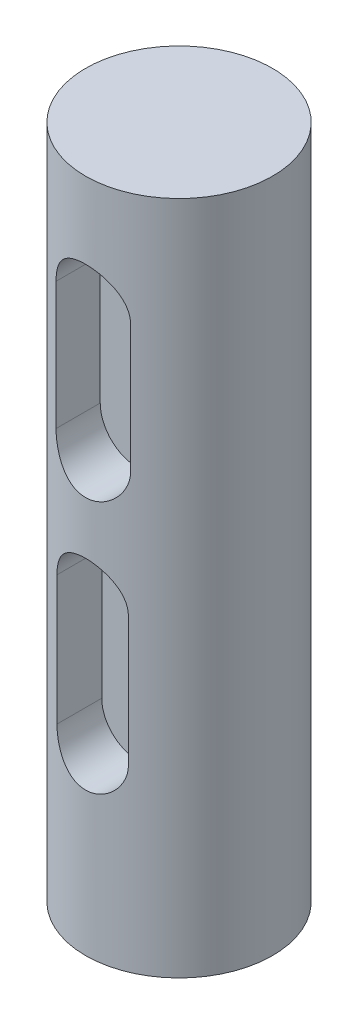
ISO-10303-21;
HEADER;
FILE_DESCRIPTION(('STEP AP214'),'2;1');
FILE_NAME('part.step','',(''),(''),'','','');
FILE_SCHEMA(('AUTOMOTIVE_DESIGN { 1 0 10303 214 1 1 1 1 }'));
ENDSEC;
DATA;
#1=APPLICATION_CONTEXT('core data for automotive mechanical design processes');
#2=APPLICATION_PROTOCOL_DEFINITION('international standard','automotive_design',2000,#1);
#3=PRODUCT_CONTEXT('',#1,'mechanical');
#4=PRODUCT('Part','Part','',(#3));
#5=PRODUCT_RELATED_PRODUCT_CATEGORY('part','',(#4));
#6=PRODUCT_DEFINITION_FORMATION('','',#4);
#7=PRODUCT_DEFINITION_CONTEXT('part definition',#1,'design');
#8=PRODUCT_DEFINITION('design','',#6,#7);
#9=PRODUCT_DEFINITION_SHAPE('','',#8);
#10=(LENGTH_UNIT() NAMED_UNIT(*) SI_UNIT(.MILLI.,.METRE.));
#11=(NAMED_UNIT(*) PLANE_ANGLE_UNIT() SI_UNIT($,.RADIAN.));
#12=(NAMED_UNIT(*) SI_UNIT($,.STERADIAN.) SOLID_ANGLE_UNIT());
#13=UNCERTAINTY_MEASURE_WITH_UNIT(LENGTH_MEASURE(1.E-05),#10,'distance_accuracy_value','');
#14=(GEOMETRIC_REPRESENTATION_CONTEXT(3) GLOBAL_UNCERTAINTY_ASSIGNED_CONTEXT((#13)) GLOBAL_UNIT_ASSIGNED_CONTEXT((#10,
#11,#12)) REPRESENTATION_CONTEXT('',''));
#15=CARTESIAN_POINT('',(0.,0.,0.));
#16=DIRECTION('',(0.,0.,1.));
#17=DIRECTION('',(1.,0.,0.));
#18=AXIS2_PLACEMENT_3D('',#15,#16,#17);
#19=CARTESIAN_POINT('',(0.,75.,0.));
#20=DIRECTION('',(0.,-1.,0.));
#21=DIRECTION('',(0.,0.,-1.));
#22=AXIS2_PLACEMENT_3D('',#19,#20,#21);
#23=CYLINDRICAL_SURFACE('',#22,9.);
#24=DIRECTION('',(0.,-1.,0.));
#25=VECTOR('',#24,1.);
#26=CARTESIAN_POINT('',(-3.59075279249924,75.,8.25266589552484));
#27=LINE('',#26,#25);
#28=CARTESIAN_POINT('',(-3.59075279249924,51.7898163154883,8.25266589552484));
#29=VERTEX_POINT('',#28);
#30=CARTESIAN_POINT('',(-3.59075279249924,64.069272058532,8.25266589552484));
#31=VERTEX_POINT('',#30);
#32=EDGE_CURVE('E11',#29,#31,#27,.F.);
#33=ORIENTED_EDGE('',*,*,#32,.T.);
#34=CARTESIAN_POINT('',(-3.59075279249924,64.069272058532,8.25266589552484));
#35=CARTESIAN_POINT('',(-3.59076709651174,64.1658968866737,8.25264612613384));
#36=CARTESIAN_POINT('',(-3.58685301131658,64.2625109089135,8.25436238712671));
#37=CARTESIAN_POINT('',(-3.57127985461796,64.4549601143541,8.26111925578927));
#38=CARTESIAN_POINT('',(-3.55962371784079,64.5507955787492,8.266158603794));
#39=CARTESIAN_POINT('',(-3.52873863815754,64.7406326124207,8.27938820607556));
#40=CARTESIAN_POINT('',(-3.5095395051871,64.8346398902062,8.28756605408234));
#41=CARTESIAN_POINT('',(-3.46378376848268,65.020524449781,8.30679330478129));
#42=CARTESIAN_POINT('',(-3.4372267188772,65.1124016021244,8.31784288149059));
#43=CARTESIAN_POINT('',(-3.34693519354362,65.3837137113802,8.35477670172495));
#44=CARTESIAN_POINT('',(-3.27251821463925,65.5592053813268,8.38447437109656));
#45=CARTESIAN_POINT('',(-3.09760834717961,65.8952866001117,8.45065222473362));
#46=CARTESIAN_POINT('',(-2.99709081465851,66.0558618693801,8.48713880976911));
#47=CARTESIAN_POINT('',(-2.76678797282219,66.3665839232752,8.5650673580961));
#48=CARTESIAN_POINT('',(-2.63577050713792,66.5157798647041,8.60666720536653));
#49=CARTESIAN_POINT('',(-2.35080086119998,66.7907550095467,8.68882660197574));
#50=CARTESIAN_POINT('',(-2.19684399599132,66.9165294177056,8.7293859368207));
#51=CARTESIAN_POINT('',(-1.86291833405368,67.1458994838985,8.80681575203263));
#52=CARTESIAN_POINT('',(-1.68216537916092,67.2484300106859,8.84347877797822));
#53=CARTESIAN_POINT('',(-1.30425480268085,67.4212179182776,8.90705063889267));
#54=CARTESIAN_POINT('',(-1.10710403695434,67.4914887074321,8.93396352540065));
#55=CARTESIAN_POINT('',(-0.712072167601763,67.5943370425934,8.97387538097098));
#56=CARTESIAN_POINT('',(-0.514684215767548,67.628568023177,8.9874824304237));
#57=CARTESIAN_POINT('',(-0.116524494222606,67.6636882809914,9.00144682073262));
#58=CARTESIAN_POINT('',(0.0842460585362407,67.6645893034143,9.0018088290275));
#59=CARTESIAN_POINT('',(0.471521063273848,67.6339315175917,8.98961246121658));
#60=CARTESIAN_POINT('',(0.658195722534287,67.6041839944227,8.97777504261354));
#61=CARTESIAN_POINT('',(1.0236452501598,67.5161531166525,8.94348079918929));
#62=CARTESIAN_POINT('',(1.20241967067364,67.4578681465681,8.92102337318));
#63=CARTESIAN_POINT('',(1.55021403821633,67.3137023219387,8.86725972291739));
#64=CARTESIAN_POINT('',(1.71904653631176,67.2274190928186,8.83582532925205));
#65=CARTESIAN_POINT('',(2.04027578588213,67.0300724957277,8.76722826130333));
#66=CARTESIAN_POINT('',(2.1926667588418,66.9190004573309,8.73006358413793));
#67=CARTESIAN_POINT('',(2.48723266522941,66.6668105543173,8.65092131531831));
#68=CARTESIAN_POINT('',(2.62809111247902,66.5242045403318,8.60878791330133));
#69=CARTESIAN_POINT('',(2.88449695700154,66.2170990971296,8.52630393976015));
#70=CARTESIAN_POINT('',(3.00003289670429,66.0525898113221,8.48595418183853));
#71=CARTESIAN_POINT('',(3.15331874440256,65.7899681181672,8.42968932984504));
#72=CARTESIAN_POINT('',(3.20161304438927,65.6983632139531,8.41141679363003));
#73=CARTESIAN_POINT('',(3.29024113557402,65.5109872770805,8.37714566146151));
#74=CARTESIAN_POINT('',(3.33057835674223,65.4152180613084,8.36114608656357));
#75=CARTESIAN_POINT('',(3.40286230014206,65.2202840847592,8.33198953593521));
#76=CARTESIAN_POINT('',(3.43481941395235,65.1211237033572,8.31882904328712));
#77=CARTESIAN_POINT('',(3.49005588446221,64.9200829086853,8.29580613507968));
#78=CARTESIAN_POINT('',(3.51333913286549,64.818203737296,8.28594224064029));
#79=CARTESIAN_POINT('',(3.55159656261248,64.6090287399184,8.26962135484079));
#80=CARTESIAN_POINT('',(3.56626259279074,64.501666327232,8.26329107630287));
#81=CARTESIAN_POINT('',(3.58584966301004,64.2859638341549,8.25479871639156));
#82=CARTESIAN_POINT('',(3.59077684984484,64.1776244138256,8.25263400589022));
#83=CARTESIAN_POINT('',(3.59075279249924,64.069272058532,8.25266589552485));
#84=B_SPLINE_CURVE_WITH_KNOTS('',3,(#34,#35,#36,#37,#38,#39,#40,#41,#42,#43,#44,#45,#46,#47,#48,
#49,#50,#51,#52,#53,#54,#55,#56,#57,#58,#59,#60,#61,#62,#63,#64,#65,#66,#67,#68,#69,#70,#71,#72,
#73,#74,#75,#76,#77,#78,#79,#80,#81,#82,#83),.UNSPECIFIED.,.F.,.F.,(4,2,2,2,2,2,2,2,2,2,2,2,2,2,
2,2,2,2,2,2,2,2,2,2,4),(0.,0.289761992126611,0.579414208803354,0.867933051447296,
1.15646938144347,1.73240982352938,2.30889605467612,2.91481176706974,3.52085139677538,
4.1506941892618,4.78027495805066,5.37951245530823,5.97853878438653,6.54408701922678,
7.10966727302489,7.68376516098306,8.25806416776978,8.86985669930655,9.48192547722016,
9.79705360351955,10.1120455927474,10.4266451155904,10.7411033165615,11.0662126321862,
11.3911166853599),.UNSPECIFIED.);
#85=CARTESIAN_POINT('',(3.59075279249924,64.069272058532,8.25266589552484));
#86=VERTEX_POINT('',#85);
#87=EDGE_CURVE('E241',#31,#86,#84,.T.);
#88=ORIENTED_EDGE('',*,*,#87,.T.);
#89=DIRECTION('',(0.,-1.,0.));
#90=VECTOR('',#89,1.);
#91=CARTESIAN_POINT('',(3.59075279249924,75.,8.25266589552484));
#92=LINE('',#91,#90);
#93=CARTESIAN_POINT('',(3.59075279249924,51.7898163154883,8.25266589552484));
#94=VERTEX_POINT('',#93);
#95=EDGE_CURVE('E52',#86,#94,#92,.T.);
#96=ORIENTED_EDGE('',*,*,#95,.T.);
#97=CARTESIAN_POINT('',(3.59075279249924,51.7898163154883,8.25266589552485));
#98=CARTESIAN_POINT('',(3.59076709651174,51.6931914873466,8.25264612613384));
#99=CARTESIAN_POINT('',(3.58685301131658,51.5965774651067,8.25436238712671));
#100=CARTESIAN_POINT('',(3.57127985461796,51.4041282596661,8.26111925578927));
#101=CARTESIAN_POINT('',(3.55962371784079,51.308292795271,8.266158603794));
#102=CARTESIAN_POINT('',(3.52873863815754,51.1184557615995,8.27938820607557));
#103=CARTESIAN_POINT('',(3.50953950518709,51.0244484838141,8.28756605408234));
#104=CARTESIAN_POINT('',(3.46378376848268,50.8385639242392,8.30679330478129));
#105=CARTESIAN_POINT('',(3.4372267188772,50.7466867718959,8.31784288149058));
#106=CARTESIAN_POINT('',(3.34693519354362,50.4753746626401,8.35477670172495));
#107=CARTESIAN_POINT('',(3.27251821463925,50.2998829926934,8.38447437109655));
#108=CARTESIAN_POINT('',(3.0976083471796,49.9638017739085,8.45065222473362));
#109=CARTESIAN_POINT('',(2.9970908146585,49.8032265046402,8.48713880976911));
#110=CARTESIAN_POINT('',(2.76678797282218,49.4925044507451,8.5650673580961));
#111=CARTESIAN_POINT('',(2.63577050713791,49.3433085093162,8.60666720536654));
#112=CARTESIAN_POINT('',(2.35080086119998,49.0683333644736,8.68882660197574));
#113=CARTESIAN_POINT('',(2.19684399599131,48.9425589563147,8.72938593682069));
#114=CARTESIAN_POINT('',(1.86291833405368,48.7131888901217,8.80681575203263));
#115=CARTESIAN_POINT('',(1.68216537916092,48.6106583633344,8.84347877797821));
#116=CARTESIAN_POINT('',(1.30425480268085,48.4378704557426,8.90705063889267));
#117=CARTESIAN_POINT('',(1.10710403695434,48.3675996665882,8.93396352540065));
#118=CARTESIAN_POINT('',(0.71207216760177,48.2647513314268,8.97387538097098));
#119=CARTESIAN_POINT('',(0.514684215767555,48.2305203508433,8.9874824304237));
#120=CARTESIAN_POINT('',(0.11652449422261,48.1954000930289,9.00144682073262));
#121=CARTESIAN_POINT('',(-0.0842460585362386,48.194499070606,9.0018088290275));
#122=CARTESIAN_POINT('',(-0.471521063273848,48.2251568564285,8.98961246121658));
#123=CARTESIAN_POINT('',(-0.658195722534286,48.2549043795975,8.97777504261354));
#124=CARTESIAN_POINT('',(-1.0236452501598,48.3429352573677,8.94348079918929));
#125=CARTESIAN_POINT('',(-1.20241967067364,48.4012202274522,8.92102337318));
#126=CARTESIAN_POINT('',(-1.55021403821633,48.5453860520816,8.86725972291739));
#127=CARTESIAN_POINT('',(-1.71904653631176,48.6316692812017,8.83582532925205));
#128=CARTESIAN_POINT('',(-2.04027578588213,48.8290158782925,8.76722826130333));
#129=CARTESIAN_POINT('',(-2.1926667588418,48.9400879166894,8.73006358413793));
#130=CARTESIAN_POINT('',(-2.48723266522941,49.1922778197029,8.65092131531831));
#131=CARTESIAN_POINT('',(-2.62809111247902,49.3348838336885,8.60878791330133));
#132=CARTESIAN_POINT('',(-2.88449695700154,49.6419892768906,8.52630393976015));
#133=CARTESIAN_POINT('',(-3.00003289670429,49.8064985626981,8.48595418183852));
#134=CARTESIAN_POINT('',(-3.15331874440256,50.069120255853,8.42968932984504));
#135=CARTESIAN_POINT('',(-3.20161304438926,50.1607251600672,8.41141679363003));
#136=CARTESIAN_POINT('',(-3.29024113557401,50.3481010969398,8.37714566146152));
#137=CARTESIAN_POINT('',(-3.33057835674223,50.4438703127119,8.36114608656358));
#138=CARTESIAN_POINT('',(-3.40286230014206,50.638804289261,8.33198953593521));
#139=CARTESIAN_POINT('',(-3.43481941395235,50.7379646706631,8.31882904328712));
#140=CARTESIAN_POINT('',(-3.49005588446221,50.939005465335,8.29580613507968));
#141=CARTESIAN_POINT('',(-3.51333913286549,51.0408846367242,8.28594224064029));
#142=CARTESIAN_POINT('',(-3.55159656261248,51.2500596341019,8.2696213548408));
#143=CARTESIAN_POINT('',(-3.56626259279074,51.3574220467883,8.26329107630287));
#144=CARTESIAN_POINT('',(-3.58584966301004,51.5731245398654,8.25479871639156));
#145=CARTESIAN_POINT('',(-3.59077684984484,51.6814639601946,8.25263400589023));
#146=CARTESIAN_POINT('',(-3.59075279249924,51.7898163154883,8.25266589552485));
#147=B_SPLINE_CURVE_WITH_KNOTS('',3,(#97,#98,#99,#100,#101,#102,#103,#104,#105,#106,#107,#108,
#109,#110,#111,#112,#113,#114,#115,#116,#117,#118,#119,#120,#121,#122,#123,#124,#125,#126,#127,
#128,#129,#130,#131,#132,#133,#134,#135,#136,#137,#138,#139,#140,#141,#142,#143,#144,#145,#146),
.UNSPECIFIED.,.F.,.F.,(4,2,2,2,2,2,2,2,2,2,2,2,2,2,2,2,2,2,2,2,2,2,2,2,4),(0.,0.289761992126632,
0.579414208803375,0.867933051447303,1.15646938144347,1.7324098235294,2.30889605467614,
2.91481176706975,3.52085139677538,4.15069418926179,4.78027495805065,5.37951245530822,
5.97853878438652,6.54408701922678,7.10966727302489,7.68376516098306,8.25806416776977,
8.86985669930653,9.48192547722016,9.79705360351954,10.1120455927474,10.4266451155904,
10.7411033165615,11.0662126321862,11.3911166853599),.UNSPECIFIED.);
#148=EDGE_CURVE('E59',#94,#29,#147,.T.);
#149=ORIENTED_EDGE('',*,*,#148,.T.);
#150=EDGE_LOOP('',(#33,#88,#96,#149));
#151=FACE_BOUND('',#150,.T.);
#152=DIRECTION('',(0.,-1.,0.));
#153=VECTOR('',#152,1.);
#154=CARTESIAN_POINT('',(-3.44161609504719,75.,8.31596528698335));
#155=LINE('',#154,#153);
#156=CARTESIAN_POINT('',(-3.44161609504719,27.2483775892211,8.31596528698335));
#157=VERTEX_POINT('',#156);
#158=CARTESIAN_POINT('',(-3.44161609504719,39.6967762308812,8.31596528698335));
#159=VERTEX_POINT('',#158);
#160=EDGE_CURVE('E235',#157,#159,#155,.F.);
#161=ORIENTED_EDGE('',*,*,#160,.T.);
#162=CARTESIAN_POINT('',(-3.44161609504719,39.6967762308812,8.31596528698335));
#163=CARTESIAN_POINT('',(-3.44162944610178,39.7897359410919,8.3159473977352));
#164=CARTESIAN_POINT('',(-3.43785010797841,39.882685848242,8.31752357689273));
#165=CARTESIAN_POINT('',(-3.42281030430182,40.0678442682913,8.32373054436181));
#166=CARTESIAN_POINT('',(-3.41155244700991,40.1600530283343,8.32836026769366));
#167=CARTESIAN_POINT('',(-3.38171434418882,40.3427387118354,8.34051871117113));
#168=CARTESIAN_POINT('',(-3.36316100870783,40.4332207328121,8.34803677509033));
#169=CARTESIAN_POINT('',(-3.31893507752917,40.6121420323086,8.36571779720752));
#170=CARTESIAN_POINT('',(-3.29326209909297,40.7005812007316,8.37588089759588));
#171=CARTESIAN_POINT('',(-3.2059495141957,40.9617724623423,8.40986490833764));
#172=CARTESIAN_POINT('',(-3.13396045291825,41.1307350742718,8.43720473801134));
#173=CARTESIAN_POINT('',(-2.96470161139858,41.4542444285838,8.49815238691096));
#174=CARTESIAN_POINT('',(-2.86741016906527,41.608778663602,8.5317655699371));
#175=CARTESIAN_POINT('',(-2.64494010081819,41.9070243671511,8.60340354604182));
#176=CARTESIAN_POINT('',(-2.51866988064436,42.0498914477862,8.64156115225438));
#177=CARTESIAN_POINT('',(-2.24414680901578,42.3130133432318,8.71688282229207));
#178=CARTESIAN_POINT('',(-2.09588964058467,42.4332637068747,8.75404668930863));
#179=CARTESIAN_POINT('',(-1.77509335025524,42.6518984073682,8.82479060427513));
#180=CARTESIAN_POINT('',(-1.60187753397646,42.7493515760627,8.85819589924715));
#181=CARTESIAN_POINT('',(-1.24001013085664,42.9133762630388,8.91604598525601));
#182=CARTESIAN_POINT('',(-1.05136453068404,42.9799596923657,8.9404942315923));
#183=CARTESIAN_POINT('',(-0.67293101539553,43.0773582237,8.97672878470203));
#184=CARTESIAN_POINT('',(-0.483570626826958,43.109638358715,8.98903195928352));
#185=CARTESIAN_POINT('',(-0.101744140097608,43.1422150606168,9.00144904188801));
#186=CARTESIAN_POINT('',(0.0907209410987434,43.1425218960506,9.00156686335967));
#187=CARTESIAN_POINT('',(0.462762364696906,43.1119806317634,8.98992410345663));
#188=CARTESIAN_POINT('',(0.642492599240474,43.0827335541362,8.97877393955046));
#189=CARTESIAN_POINT('',(0.994267625852061,42.9966173902006,8.9466553710748));
#190=CARTESIAN_POINT('',(1.16631198087508,42.9397467353001,8.92568640895182));
#191=CARTESIAN_POINT('',(1.50085099852246,42.7992871432034,8.87561266087173));
#192=CARTESIAN_POINT('',(1.66316752848686,42.715316750896,8.84639251361648));
#193=CARTESIAN_POINT('',(1.97181457069996,42.5233867388531,8.7827567900254));
#194=CARTESIAN_POINT('',(2.11813972883839,42.4154191210304,8.74833948274591));
#195=CARTESIAN_POINT('',(2.40004858635442,42.1709146810063,8.67538138807613));
#196=CARTESIAN_POINT('',(2.5344458844829,42.033044089369,8.63671710750559));
#197=CARTESIAN_POINT('',(2.77868295914476,41.7365279461087,8.56126713249105));
#198=CARTESIAN_POINT('',(2.88851267194718,41.5778739229167,8.52448221264151));
#199=CARTESIAN_POINT('',(3.08295695277028,41.2391932946528,8.4561408548142));
#200=CARTESIAN_POINT('',(3.16689122249884,41.0587398061984,8.42473381408577));
#201=CARTESIAN_POINT('',(3.26869220019801,40.7785711340614,8.38552016481041));
#202=CARTESIAN_POINT('',(3.29860517404841,40.6836221876886,8.37376682493255));
#203=CARTESIAN_POINT('',(3.35015199371231,40.4911976660463,8.35327798654851));
#204=CARTESIAN_POINT('',(3.37178956858183,40.393723249996,8.34454112892967));
#205=CARTESIAN_POINT('',(3.40657856234909,40.1967464682883,8.3304019174156));
#206=CARTESIAN_POINT('',(3.41970552641287,40.097239098726,8.32500917459007));
#207=CARTESIAN_POINT('',(3.43722960511469,39.897417295057,8.31778027690792));
#208=CARTESIAN_POINT('',(3.44163409893674,39.7971036152962,8.31594111576378));
#209=CARTESIAN_POINT('',(3.44161609504719,39.6967762308812,8.31596528698335));
#210=B_SPLINE_CURVE_WITH_KNOTS('',3,(#162,#163,#164,#165,#166,#167,#168,#169,#170,#171,#172,
#173,#174,#175,#176,#177,#178,#179,#180,#181,#182,#183,#184,#185,#186,#187,#188,#189,#190,#191,
#192,#193,#194,#195,#196,#197,#198,#199,#200,#201,#202,#203,#204,#205,#206,#207,#208,#209),
.UNSPECIFIED.,.F.,.F.,(4,2,2,2,2,2,2,2,2,2,2,2,2,2,2,2,2,2,2,2,2,2,2,4),(0.,0.278772585011864,
0.557447994332301,0.835104983333213,1.11277690154271,1.66710700323056,2.22191325404647,
2.80267160848012,3.3835441419019,3.98510217255019,4.58642789931251,5.16088992562772,
5.73516745711433,6.27991846830345,6.82470041654394,7.37751209785385,7.93050830398818,
8.51697936818884,9.10369023302002,9.70471032871195,10.0050877214768,10.3053295984061,
10.6064304265881,10.9072764153554),.UNSPECIFIED.);
#211=CARTESIAN_POINT('',(3.44161609504719,39.6967762308812,8.31596528698335));
#212=VERTEX_POINT('',#211);
#213=EDGE_CURVE('E184',#159,#212,#210,.T.);
#214=ORIENTED_EDGE('',*,*,#213,.T.);
#215=DIRECTION('',(0.,-1.,0.));
#216=VECTOR('',#215,1.);
#217=CARTESIAN_POINT('',(3.44161609504719,75.,8.31596528698335));
#218=LINE('',#217,#216);
#219=CARTESIAN_POINT('',(3.44161609504719,27.2483775892211,8.31596528698335));
#220=VERTEX_POINT('',#219);
#221=EDGE_CURVE('E242',#212,#220,#218,.T.);
#222=ORIENTED_EDGE('',*,*,#221,.T.);
#223=CARTESIAN_POINT('',(3.44161609504719,27.2483775892211,8.31596528698335));
#224=CARTESIAN_POINT('',(3.44162944610178,27.1554178790104,8.3159473977352));
#225=CARTESIAN_POINT('',(3.43785010797841,27.0624679718603,8.31752357689273));
#226=CARTESIAN_POINT('',(3.42281030430182,26.8773095518111,8.32373054436181));
#227=CARTESIAN_POINT('',(3.41155244700992,26.7851007917681,8.32836026769366));
#228=CARTESIAN_POINT('',(3.38171434418882,26.6024151082669,8.34051871117113));
#229=CARTESIAN_POINT('',(3.36316100870783,26.5119330872902,8.34803677509033));
#230=CARTESIAN_POINT('',(3.31893507752917,26.3330117877937,8.36571779720752));
#231=CARTESIAN_POINT('',(3.29326209909296,26.2445726193707,8.37588089759588));
#232=CARTESIAN_POINT('',(3.2059495141957,25.9833813577601,8.40986490833764));
#233=CARTESIAN_POINT('',(3.13396045291825,25.8144187458305,8.43720473801134));
#234=CARTESIAN_POINT('',(2.96470161139858,25.4909093915185,8.49815238691096));
#235=CARTESIAN_POINT('',(2.86741016906526,25.3363751565003,8.5317655699371));
#236=CARTESIAN_POINT('',(2.64494010081819,25.0381294529512,8.60340354604183));
#237=CARTESIAN_POINT('',(2.51866988064436,24.8952623723161,8.64156115225438));
#238=CARTESIAN_POINT('',(2.24414680901578,24.6321404768706,8.71688282229207));
#239=CARTESIAN_POINT('',(2.09588964058467,24.5118901132277,8.75404668930863));
#240=CARTESIAN_POINT('',(1.77509335025523,24.2932554127342,8.82479060427513));
#241=CARTESIAN_POINT('',(1.60187753397646,24.1958022440396,8.85819589924715));
#242=CARTESIAN_POINT('',(1.24001013085664,24.0317775570635,8.91604598525601));
#243=CARTESIAN_POINT('',(1.05136453068404,23.9651941277366,8.9404942315923));
#244=CARTESIAN_POINT('',(0.672931015395527,23.8677955964023,8.97672878470203));
#245=CARTESIAN_POINT('',(0.483570626826955,23.8355154613874,8.98903195928352));
#246=CARTESIAN_POINT('',(0.101744140097605,23.8029387594855,9.00144904188801));
#247=CARTESIAN_POINT('',(-0.0907209410987462,23.8026319240518,9.00156686335967));
#248=CARTESIAN_POINT('',(-0.462762364696909,23.833173188339,8.98992410345663));
#249=CARTESIAN_POINT('',(-0.642492599240477,23.8624202659662,8.97877393955046));
#250=CARTESIAN_POINT('',(-0.994267625852064,23.9485364299018,8.9466553710748));
#251=CARTESIAN_POINT('',(-1.16631198087508,24.0054070848023,8.92568640895182));
#252=CARTESIAN_POINT('',(-1.50085099852246,24.145866676899,8.87561266087173));
#253=CARTESIAN_POINT('',(-1.66316752848686,24.2298370692063,8.84639251361648));
#254=CARTESIAN_POINT('',(-1.97181457069996,24.4217670812492,8.7827567900254));
#255=CARTESIAN_POINT('',(-2.1181397288384,24.529734699072,8.74833948274591));
#256=CARTESIAN_POINT('',(-2.40004858635442,24.774239139096,8.67538138807613));
#257=CARTESIAN_POINT('',(-2.5344458844829,24.9121097307333,8.63671710750559));
#258=CARTESIAN_POINT('',(-2.77868295914477,25.2086258739936,8.56126713249105));
#259=CARTESIAN_POINT('',(-2.88851267194718,25.3672798971856,8.52448221264151));
#260=CARTESIAN_POINT('',(-3.08295695277028,25.7059605254496,8.4561408548142));
#261=CARTESIAN_POINT('',(-3.16689122249884,25.886414013904,8.42473381408577));
#262=CARTESIAN_POINT('',(-3.26869220019801,26.166582686041,8.38552016481041));
#263=CARTESIAN_POINT('',(-3.29860517404841,26.2615316324138,8.37376682493255));
#264=CARTESIAN_POINT('',(-3.35015199371231,26.453956154056,8.35327798654851));
#265=CARTESIAN_POINT('',(-3.37178956858183,26.5514305701063,8.34454112892967));
#266=CARTESIAN_POINT('',(-3.40657856234909,26.748407351814,8.3304019174156));
#267=CARTESIAN_POINT('',(-3.41970552641287,26.8479147213763,8.32500917459007));
#268=CARTESIAN_POINT('',(-3.43722960511469,27.0477365250453,8.31778027690792));
#269=CARTESIAN_POINT('',(-3.44163409893674,27.1480502048061,8.31594111576378));
#270=CARTESIAN_POINT('',(-3.44161609504719,27.2483775892211,8.31596528698335));
#271=B_SPLINE_CURVE_WITH_KNOTS('',3,(#223,#224,#225,#226,#227,#228,#229,#230,#231,#232,#233,
#234,#235,#236,#237,#238,#239,#240,#241,#242,#243,#244,#245,#246,#247,#248,#249,#250,#251,#252,
#253,#254,#255,#256,#257,#258,#259,#260,#261,#262,#263,#264,#265,#266,#267,#268,#269,#270),
.UNSPECIFIED.,.F.,.F.,(4,2,2,2,2,2,2,2,2,2,2,2,2,2,2,2,2,2,2,2,2,2,2,4),(0.,0.278772585011854,
0.557447994332301,0.835104983333212,1.11277690154271,1.66710700323057,2.22191325404647,
2.80267160848012,3.3835441419019,3.98510217255019,4.58642789931251,5.16088992562772,
5.73516745711433,6.27991846830345,6.82470041654394,7.37751209785385,7.93050830398819,
8.51697936818884,9.10369023302002,9.70471032871195,10.0050877214768,10.3053295984061,
10.6064304265881,10.9072764153554),.UNSPECIFIED.);
#272=EDGE_CURVE('E67',#220,#157,#271,.T.);
#273=ORIENTED_EDGE('',*,*,#272,.T.);
#274=EDGE_LOOP('',(#161,#214,#222,#273));
#275=FACE_BOUND('',#274,.T.);
#276=CARTESIAN_POINT('',(0.,75.,0.));
#277=DIRECTION('',(0.,1.,0.));
#278=DIRECTION('',(0.,0.,1.));
#279=AXIS2_PLACEMENT_3D('',#276,#277,#278);
#280=CIRCLE('',#279,9.);
#281=CARTESIAN_POINT('',(0.,75.,9.));
#282=VERTEX_POINT('',#281);
#283=EDGE_CURVE('E180',#282,#282,#280,.T.);
#284=ORIENTED_EDGE('',*,*,#283,.F.);
#285=EDGE_LOOP('',(#284));
#286=FACE_BOUND('',#285,.T.);
#287=CARTESIAN_POINT('',(0.,10.,0.));
#288=DIRECTION('',(0.,1.,0.));
#289=DIRECTION('',(0.,0.,1.));
#290=AXIS2_PLACEMENT_3D('',#287,#288,#289);
#291=CIRCLE('',#290,9.);
#292=CARTESIAN_POINT('',(0.,10.,9.));
#293=VERTEX_POINT('',#292);
#294=EDGE_CURVE('E169',#293,#293,#291,.T.);
#295=ORIENTED_EDGE('',*,*,#294,.T.);
#296=EDGE_LOOP('',(#295));
#297=FACE_BOUND('',#296,.T.);
#298=ADVANCED_FACE('F43',(#151,#275,#286,#297),#23,.T.);
#299=CARTESIAN_POINT('',(0.,75.,0.));
#300=DIRECTION('',(0.,1.,0.));
#301=DIRECTION('',(0.,0.,1.));
#302=AXIS2_PLACEMENT_3D('',#299,#300,#301);
#303=PLANE('',#302);
#304=ORIENTED_EDGE('',*,*,#283,.T.);
#305=EDGE_LOOP('',(#304));
#306=FACE_BOUND('',#305,.T.);
#307=ADVANCED_FACE('F219',(#306),#303,.T.);
#308=CARTESIAN_POINT('',(0.,10.,0.));
#309=DIRECTION('',(0.,1.,0.));
#310=DIRECTION('',(0.,0.,1.));
#311=AXIS2_PLACEMENT_3D('',#308,#309,#310);
#312=PLANE('',#311);
#313=ORIENTED_EDGE('',*,*,#294,.F.);
#314=EDGE_LOOP('',(#313));
#315=FACE_BOUND('',#314,.T.);
#316=ADVANCED_FACE('F218',(#315),#312,.F.);
#317=CARTESIAN_POINT('',(0.,27.2483775892211,4.));
#318=DIRECTION('',(0.,0.,1.));
#319=DIRECTION('',(1.,0.,0.));
#320=AXIS2_PLACEMENT_3D('',#317,#318,#319);
#321=CYLINDRICAL_SURFACE('',#320,3.44161609504719);
#322=DIRECTION('',(0.,0.,1.));
#323=VECTOR('',#322,1.);
#324=CARTESIAN_POINT('',(3.44161609504719,27.2483775892211,4.));
#325=LINE('',#324,#323);
#326=CARTESIAN_POINT('',(3.44161609504719,27.2483775892211,4.));
#327=VERTEX_POINT('',#326);
#328=EDGE_CURVE('E165',#327,#220,#325,.T.);
#329=ORIENTED_EDGE('',*,*,#328,.F.);
#330=CARTESIAN_POINT('',(0.,27.2483775892211,4.));
#331=DIRECTION('',(0.,0.,1.));
#332=DIRECTION('',(1.,0.,0.));
#333=AXIS2_PLACEMENT_3D('',#330,#331,#332);
#334=CIRCLE('',#333,3.44161609504719);
#335=CARTESIAN_POINT('',(-3.44161609504719,27.2483775892211,4.));
#336=VERTEX_POINT('',#335);
#337=EDGE_CURVE('E143',#336,#327,#334,.T.);
#338=ORIENTED_EDGE('',*,*,#337,.F.);
#339=DIRECTION('',(0.,0.,1.));
#340=VECTOR('',#339,1.);
#341=CARTESIAN_POINT('',(-3.44161609504719,27.2483775892211,4.));
#342=LINE('',#341,#340);
#343=EDGE_CURVE('E166',#336,#157,#342,.T.);
#344=ORIENTED_EDGE('',*,*,#343,.T.);
#345=ORIENTED_EDGE('',*,*,#272,.F.);
#346=EDGE_LOOP('',(#329,#338,#344,#345));
#347=FACE_BOUND('',#346,.T.);
#348=ADVANCED_FACE('F214',(#347),#321,.F.);
#349=CARTESIAN_POINT('',(-3.44161609504719,27.2483775892211,4.));
#350=DIRECTION('',(-1.,0.,0.));
#351=DIRECTION('',(0.,0.,1.));
#352=AXIS2_PLACEMENT_3D('',#349,#350,#351);
#353=PLANE('',#352);
#354=ORIENTED_EDGE('',*,*,#343,.F.);
#355=DIRECTION('',(0.,-1.,0.));
#356=VECTOR('',#355,1.);
#357=CARTESIAN_POINT('',(-3.44161609504719,27.2483775892211,4.));
#358=LINE('',#357,#356);
#359=CARTESIAN_POINT('',(-3.44161609504719,39.6967762308812,4.));
#360=VERTEX_POINT('',#359);
#361=EDGE_CURVE('E161',#360,#336,#358,.T.);
#362=ORIENTED_EDGE('',*,*,#361,.F.);
#363=DIRECTION('',(0.,0.,1.));
#364=VECTOR('',#363,1.);
#365=CARTESIAN_POINT('',(-3.44161609504719,39.6967762308812,4.));
#366=LINE('',#365,#364);
#367=EDGE_CURVE('E170',#360,#159,#366,.T.);
#368=ORIENTED_EDGE('',*,*,#367,.T.);
#369=ORIENTED_EDGE('',*,*,#160,.F.);
#370=EDGE_LOOP('',(#354,#362,#368,#369));
#371=FACE_BOUND('',#370,.T.);
#372=ADVANCED_FACE('F208',(#371),#353,.F.);
#373=CARTESIAN_POINT('',(0.,39.6967762308812,4.));
#374=DIRECTION('',(0.,0.,1.));
#375=DIRECTION('',(1.,0.,0.));
#376=AXIS2_PLACEMENT_3D('',#373,#374,#375);
#377=CYLINDRICAL_SURFACE('',#376,3.44161609504719);
#378=ORIENTED_EDGE('',*,*,#367,.F.);
#379=CARTESIAN_POINT('',(0.,39.6967762308812,4.));
#380=DIRECTION('',(0.,0.,1.));
#381=DIRECTION('',(1.,0.,0.));
#382=AXIS2_PLACEMENT_3D('',#379,#380,#381);
#383=CIRCLE('',#382,3.44161609504719);
#384=CARTESIAN_POINT('',(3.44161609504719,39.6967762308812,4.));
#385=VERTEX_POINT('',#384);
#386=EDGE_CURVE('E157',#385,#360,#383,.T.);
#387=ORIENTED_EDGE('',*,*,#386,.F.);
#388=DIRECTION('',(0.,0.,1.));
#389=VECTOR('',#388,1.);
#390=CARTESIAN_POINT('',(3.44161609504719,39.6967762308812,4.));
#391=LINE('',#390,#389);
#392=EDGE_CURVE('E174',#385,#212,#391,.T.);
#393=ORIENTED_EDGE('',*,*,#392,.T.);
#394=ORIENTED_EDGE('',*,*,#213,.F.);
#395=EDGE_LOOP('',(#378,#387,#393,#394));
#396=FACE_BOUND('',#395,.T.);
#397=ADVANCED_FACE('F202',(#396),#377,.F.);
#398=CARTESIAN_POINT('',(3.44161609504719,27.2483775892211,4.));
#399=DIRECTION('',(1.,0.,0.));
#400=DIRECTION('',(0.,0.,-1.));
#401=AXIS2_PLACEMENT_3D('',#398,#399,#400);
#402=PLANE('',#401);
#403=ORIENTED_EDGE('',*,*,#392,.F.);
#404=DIRECTION('',(0.,1.,0.));
#405=VECTOR('',#404,1.);
#406=CARTESIAN_POINT('',(3.44161609504719,27.2483775892211,4.));
#407=LINE('',#406,#405);
#408=EDGE_CURVE('E153',#327,#385,#407,.T.);
#409=ORIENTED_EDGE('',*,*,#408,.F.);
#410=ORIENTED_EDGE('',*,*,#328,.T.);
#411=ORIENTED_EDGE('',*,*,#221,.F.);
#412=EDGE_LOOP('',(#403,#409,#410,#411));
#413=FACE_BOUND('',#412,.T.);
#414=ADVANCED_FACE('F207',(#413),#402,.F.);
#415=CARTESIAN_POINT('',(0.,27.2483775892211,4.));
#416=DIRECTION('',(0.,0.,1.));
#417=DIRECTION('',(1.,0.,0.));
#418=AXIS2_PLACEMENT_3D('',#415,#416,#417);
#419=PLANE('',#418);
#420=ORIENTED_EDGE('',*,*,#337,.T.);
#421=ORIENTED_EDGE('',*,*,#408,.T.);
#422=ORIENTED_EDGE('',*,*,#386,.T.);
#423=ORIENTED_EDGE('',*,*,#361,.T.);
#424=EDGE_LOOP('',(#420,#421,#422,#423));
#425=FACE_BOUND('',#424,.T.);
#426=ADVANCED_FACE('F212',(#425),#419,.T.);
#427=CARTESIAN_POINT('',(0.,51.7898163154883,4.));
#428=DIRECTION('',(0.,0.,1.));
#429=DIRECTION('',(1.,0.,0.));
#430=AXIS2_PLACEMENT_3D('',#427,#428,#429);
#431=CYLINDRICAL_SURFACE('',#430,3.59075279249924);
#432=DIRECTION('',(0.,0.,1.));
#433=VECTOR('',#432,1.);
#434=CARTESIAN_POINT('',(3.59075279249924,51.7898163154883,4.));
#435=LINE('',#434,#433);
#436=CARTESIAN_POINT('',(3.59075279249924,51.7898163154883,4.));
#437=VERTEX_POINT('',#436);
#438=EDGE_CURVE('E109',#437,#94,#435,.T.);
#439=ORIENTED_EDGE('',*,*,#438,.F.);
#440=CARTESIAN_POINT('',(0.,51.7898163154883,4.));
#441=DIRECTION('',(0.,0.,1.));
#442=DIRECTION('',(1.,0.,0.));
#443=AXIS2_PLACEMENT_3D('',#440,#441,#442);
#444=CIRCLE('',#443,3.59075279249924);
#445=CARTESIAN_POINT('',(-3.59075279249924,51.7898163154883,4.));
#446=VERTEX_POINT('',#445);
#447=EDGE_CURVE('E113',#446,#437,#444,.T.);
#448=ORIENTED_EDGE('',*,*,#447,.F.);
#449=DIRECTION('',(0.,0.,1.));
#450=VECTOR('',#449,1.);
#451=CARTESIAN_POINT('',(-3.59075279249924,51.7898163154883,4.));
#452=LINE('',#451,#450);
#453=EDGE_CURVE('E140',#446,#29,#452,.T.);
#454=ORIENTED_EDGE('',*,*,#453,.T.);
#455=ORIENTED_EDGE('',*,*,#148,.F.);
#456=EDGE_LOOP('',(#439,#448,#454,#455));
#457=FACE_BOUND('',#456,.T.);
#458=ADVANCED_FACE('F111',(#457),#431,.F.);
#459=CARTESIAN_POINT('',(-3.59075279249924,51.7898163154883,4.));
#460=DIRECTION('',(-1.,0.,0.));
#461=DIRECTION('',(0.,-1.,0.));
#462=AXIS2_PLACEMENT_3D('',#459,#460,#461);
#463=PLANE('',#462);
#464=ORIENTED_EDGE('',*,*,#453,.F.);
#465=DIRECTION('',(0.,-1.,0.));
#466=VECTOR('',#465,1.);
#467=CARTESIAN_POINT('',(-3.59075279249924,51.7898163154883,4.));
#468=LINE('',#467,#466);
#469=CARTESIAN_POINT('',(-3.59075279249924,64.069272058532,4.));
#470=VERTEX_POINT('',#469);
#471=EDGE_CURVE('E119',#470,#446,#468,.T.);
#472=ORIENTED_EDGE('',*,*,#471,.F.);
#473=DIRECTION('',(0.,0.,1.));
#474=VECTOR('',#473,1.);
#475=CARTESIAN_POINT('',(-3.59075279249924,64.069272058532,4.));
#476=LINE('',#475,#474);
#477=EDGE_CURVE('E144',#470,#31,#476,.T.);
#478=ORIENTED_EDGE('',*,*,#477,.T.);
#479=ORIENTED_EDGE('',*,*,#32,.F.);
#480=EDGE_LOOP('',(#464,#472,#478,#479));
#481=FACE_BOUND('',#480,.T.);
#482=ADVANCED_FACE('F263',(#481),#463,.F.);
#483=CARTESIAN_POINT('',(0.,64.069272058532,4.));
#484=DIRECTION('',(0.,0.,1.));
#485=DIRECTION('',(1.,0.,0.));
#486=AXIS2_PLACEMENT_3D('',#483,#484,#485);
#487=CYLINDRICAL_SURFACE('',#486,3.59075279249924);
#488=ORIENTED_EDGE('',*,*,#477,.F.);
#489=CARTESIAN_POINT('',(0.,64.069272058532,4.));
#490=DIRECTION('',(0.,0.,1.));
#491=DIRECTION('',(1.,0.,0.));
#492=AXIS2_PLACEMENT_3D('',#489,#490,#491);
#493=CIRCLE('',#492,3.59075279249924);
#494=CARTESIAN_POINT('',(3.59075279249924,64.069272058532,4.));
#495=VERTEX_POINT('',#494);
#496=EDGE_CURVE('E129',#495,#470,#493,.T.);
#497=ORIENTED_EDGE('',*,*,#496,.F.);
#498=DIRECTION('',(0.,0.,1.));
#499=VECTOR('',#498,1.);
#500=CARTESIAN_POINT('',(3.59075279249924,64.069272058532,4.));
#501=LINE('',#500,#499);
#502=EDGE_CURVE('E118',#495,#86,#501,.T.);
#503=ORIENTED_EDGE('',*,*,#502,.T.);
#504=ORIENTED_EDGE('',*,*,#87,.F.);
#505=EDGE_LOOP('',(#488,#497,#503,#504));
#506=FACE_BOUND('',#505,.T.);
#507=ADVANCED_FACE('F258',(#506),#487,.F.);
#508=CARTESIAN_POINT('',(3.59075279249924,51.7898163154883,4.));
#509=DIRECTION('',(1.,0.,0.));
#510=DIRECTION('',(0.,1.,0.));
#511=AXIS2_PLACEMENT_3D('',#508,#509,#510);
#512=PLANE('',#511);
#513=ORIENTED_EDGE('',*,*,#502,.F.);
#514=DIRECTION('',(0.,1.,0.));
#515=VECTOR('',#514,1.);
#516=CARTESIAN_POINT('',(3.59075279249924,51.7898163154883,4.));
#517=LINE('',#516,#515);
#518=EDGE_CURVE('E122',#437,#495,#517,.T.);
#519=ORIENTED_EDGE('',*,*,#518,.F.);
#520=ORIENTED_EDGE('',*,*,#438,.T.);
#521=ORIENTED_EDGE('',*,*,#95,.F.);
#522=EDGE_LOOP('',(#513,#519,#520,#521));
#523=FACE_BOUND('',#522,.T.);
#524=ADVANCED_FACE('F123',(#523),#512,.F.);
#525=CARTESIAN_POINT('',(0.,51.7898163154883,4.));
#526=DIRECTION('',(0.,0.,1.));
#527=DIRECTION('',(1.,0.,0.));
#528=AXIS2_PLACEMENT_3D('',#525,#526,#527);
#529=PLANE('',#528);
#530=ORIENTED_EDGE('',*,*,#447,.T.);
#531=ORIENTED_EDGE('',*,*,#518,.T.);
#532=ORIENTED_EDGE('',*,*,#496,.T.);
#533=ORIENTED_EDGE('',*,*,#471,.T.);
#534=EDGE_LOOP('',(#530,#531,#532,#533));
#535=FACE_BOUND('',#534,.T.);
#536=ADVANCED_FACE('F131',(#535),#529,.T.);
#537=CLOSED_SHELL('',(#298,#307,#316,#348,#372,#397,#414,#426,#458,#482,#507,#524,#536));
#538=MANIFOLD_SOLID_BREP('B2',#537);
#539=ADVANCED_BREP_SHAPE_REPRESENTATION('',(#18,#538),#14);
#540=SHAPE_DEFINITION_REPRESENTATION(#9,#539);
ENDSEC;
END-ISO-10303-21;
